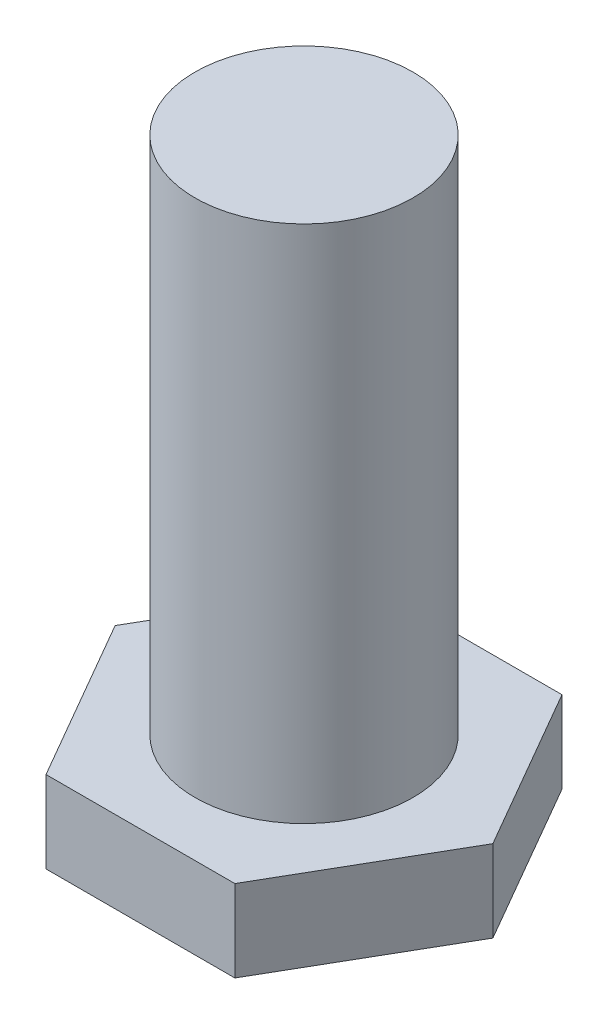
ISO-10303-21;
HEADER;
FILE_DESCRIPTION(('STEP AP214'),'2;1');
FILE_NAME('part.step','',(''),(''),'','','');
FILE_SCHEMA(('AUTOMOTIVE_DESIGN { 1 0 10303 214 1 1 1 1 }'));
ENDSEC;
DATA;
#1=APPLICATION_CONTEXT('core data for automotive mechanical design processes');
#2=APPLICATION_PROTOCOL_DEFINITION('international standard','automotive_design',2000,#1);
#3=PRODUCT_CONTEXT('',#1,'mechanical');
#4=PRODUCT('Part','Part','',(#3));
#5=PRODUCT_RELATED_PRODUCT_CATEGORY('part','',(#4));
#6=PRODUCT_DEFINITION_FORMATION('','',#4);
#7=PRODUCT_DEFINITION_CONTEXT('part definition',#1,'design');
#8=PRODUCT_DEFINITION('design','',#6,#7);
#9=PRODUCT_DEFINITION_SHAPE('','',#8);
#10=(LENGTH_UNIT() NAMED_UNIT(*) SI_UNIT(.MILLI.,.METRE.));
#11=(NAMED_UNIT(*) PLANE_ANGLE_UNIT() SI_UNIT($,.RADIAN.));
#12=(NAMED_UNIT(*) SI_UNIT($,.STERADIAN.) SOLID_ANGLE_UNIT());
#13=UNCERTAINTY_MEASURE_WITH_UNIT(LENGTH_MEASURE(1.E-05),#10,'distance_accuracy_value','');
#14=(GEOMETRIC_REPRESENTATION_CONTEXT(3) GLOBAL_UNCERTAINTY_ASSIGNED_CONTEXT((#13)) GLOBAL_UNIT_ASSIGNED_CONTEXT((#10,
#11,#12)) REPRESENTATION_CONTEXT('',''));
#15=CARTESIAN_POINT('',(0.,0.,0.));
#16=DIRECTION('',(0.,0.,1.));
#17=DIRECTION('',(1.,0.,0.));
#18=AXIS2_PLACEMENT_3D('',#15,#16,#17);
#19=CARTESIAN_POINT('',(3.46410161513775,3.,6.00000000000001));
#20=DIRECTION('',(-0.866025403784439,0.,-0.499999999999999));
#21=DIRECTION('',(-0.499999999999999,0.,0.866025403784439));
#22=AXIS2_PLACEMENT_3D('',#19,#20,#21);
#23=PLANE('',#22);
#24=DIRECTION('',(0.499999999999999,0.,-0.866025403784439));
#25=VECTOR('',#24,1.);
#26=CARTESIAN_POINT('',(3.46410161513775,0.,6.00000000000001));
#27=LINE('',#26,#25);
#28=CARTESIAN_POINT('',(3.46410161513775,0.,6.00000000000001));
#29=VERTEX_POINT('',#28);
#30=CARTESIAN_POINT('',(6.92820323027551,0.,0.));
#31=VERTEX_POINT('',#30);
#32=EDGE_CURVE('E116',#29,#31,#27,.T.);
#33=ORIENTED_EDGE('',*,*,#32,.T.);
#34=DIRECTION('',(0.,-1.,0.));
#35=VECTOR('',#34,1.);
#36=CARTESIAN_POINT('',(6.92820323027551,3.,0.));
#37=LINE('',#36,#35);
#38=CARTESIAN_POINT('',(6.92820323027551,3.,0.));
#39=VERTEX_POINT('',#38);
#40=EDGE_CURVE('E11',#39,#31,#37,.T.);
#41=ORIENTED_EDGE('',*,*,#40,.F.);
#42=DIRECTION('',(0.499999999999999,0.,-0.866025403784439));
#43=VECTOR('',#42,1.);
#44=CARTESIAN_POINT('',(3.46410161513775,3.,6.00000000000001));
#45=LINE('',#44,#43);
#46=CARTESIAN_POINT('',(3.46410161513775,3.,6.00000000000001));
#47=VERTEX_POINT('',#46);
#48=EDGE_CURVE('E127',#47,#39,#45,.T.);
#49=ORIENTED_EDGE('',*,*,#48,.F.);
#50=DIRECTION('',(0.,-1.,0.));
#51=VECTOR('',#50,1.);
#52=CARTESIAN_POINT('',(3.46410161513775,3.,6.00000000000001));
#53=LINE('',#52,#51);
#54=EDGE_CURVE('E112',#47,#29,#53,.T.);
#55=ORIENTED_EDGE('',*,*,#54,.T.);
#56=EDGE_LOOP('',(#33,#41,#49,#55));
#57=FACE_BOUND('',#56,.T.);
#58=ADVANCED_FACE('F32',(#57),#23,.F.);
#59=CARTESIAN_POINT('',(6.92820323027551,3.,0.));
#60=DIRECTION('',(-0.866025403784439,0.,0.5));
#61=DIRECTION('',(0.5,0.,0.866025403784439));
#62=AXIS2_PLACEMENT_3D('',#59,#60,#61);
#63=PLANE('',#62);
#64=DIRECTION('',(-0.5,0.,-0.866025403784439));
#65=VECTOR('',#64,1.);
#66=CARTESIAN_POINT('',(6.92820323027551,0.,0.));
#67=LINE('',#66,#65);
#68=CARTESIAN_POINT('',(3.46410161513774,0.,-6.00000000000003));
#69=VERTEX_POINT('',#68);
#70=EDGE_CURVE('E119',#31,#69,#67,.T.);
#71=ORIENTED_EDGE('',*,*,#70,.T.);
#72=DIRECTION('',(0.,-1.,0.));
#73=VECTOR('',#72,1.);
#74=CARTESIAN_POINT('',(3.46410161513774,3.,-6.00000000000003));
#75=LINE('',#74,#73);
#76=CARTESIAN_POINT('',(3.46410161513774,3.,-6.00000000000003));
#77=VERTEX_POINT('',#76);
#78=EDGE_CURVE('E40',#77,#69,#75,.T.);
#79=ORIENTED_EDGE('',*,*,#78,.F.);
#80=DIRECTION('',(-0.5,0.,-0.866025403784439));
#81=VECTOR('',#80,1.);
#82=CARTESIAN_POINT('',(6.92820323027551,3.,0.));
#83=LINE('',#82,#81);
#84=EDGE_CURVE('E85',#39,#77,#83,.T.);
#85=ORIENTED_EDGE('',*,*,#84,.F.);
#86=ORIENTED_EDGE('',*,*,#40,.T.);
#87=EDGE_LOOP('',(#71,#79,#85,#86));
#88=FACE_BOUND('',#87,.T.);
#89=ADVANCED_FACE('F152',(#88),#63,.F.);
#90=CARTESIAN_POINT('',(3.46410161513774,3.,-6.00000000000003));
#91=DIRECTION('',(0.,0.,1.));
#92=DIRECTION('',(1.,0.,0.));
#93=AXIS2_PLACEMENT_3D('',#90,#91,#92);
#94=PLANE('',#93);
#95=DIRECTION('',(-1.,0.,0.));
#96=VECTOR('',#95,1.);
#97=CARTESIAN_POINT('',(3.46410161513774,0.,-6.00000000000003));
#98=LINE('',#97,#96);
#99=CARTESIAN_POINT('',(-3.46410161513773,0.,-6.00000000000002));
#100=VERTEX_POINT('',#99);
#101=EDGE_CURVE('E122',#69,#100,#98,.T.);
#102=ORIENTED_EDGE('',*,*,#101,.T.);
#103=DIRECTION('',(0.,-1.,0.));
#104=VECTOR('',#103,1.);
#105=CARTESIAN_POINT('',(-3.46410161513773,3.,-6.00000000000002));
#106=LINE('',#105,#104);
#107=CARTESIAN_POINT('',(-3.46410161513773,3.,-6.00000000000002));
#108=VERTEX_POINT('',#107);
#109=EDGE_CURVE('E107',#108,#100,#106,.T.);
#110=ORIENTED_EDGE('',*,*,#109,.F.);
#111=DIRECTION('',(-1.,0.,0.));
#112=VECTOR('',#111,1.);
#113=CARTESIAN_POINT('',(3.46410161513774,3.,-6.00000000000003));
#114=LINE('',#113,#112);
#115=EDGE_CURVE('E98',#77,#108,#114,.T.);
#116=ORIENTED_EDGE('',*,*,#115,.F.);
#117=ORIENTED_EDGE('',*,*,#78,.T.);
#118=EDGE_LOOP('',(#102,#110,#116,#117));
#119=FACE_BOUND('',#118,.T.);
#120=ADVANCED_FACE('F133',(#119),#94,.F.);
#121=CARTESIAN_POINT('',(-3.46410161513773,3.,-6.00000000000002));
#122=DIRECTION('',(0.866025403784438,0.,0.500000000000001));
#123=DIRECTION('',(0.500000000000001,0.,-0.866025403784438));
#124=AXIS2_PLACEMENT_3D('',#121,#122,#123);
#125=PLANE('',#124);
#126=DIRECTION('',(-0.500000000000001,0.,0.866025403784438));
#127=VECTOR('',#126,1.);
#128=CARTESIAN_POINT('',(-3.46410161513773,0.,-6.00000000000002));
#129=LINE('',#128,#127);
#130=CARTESIAN_POINT('',(-6.9282032302755,0.,0.));
#131=VERTEX_POINT('',#130);
#132=EDGE_CURVE('E106',#100,#131,#129,.T.);
#133=ORIENTED_EDGE('',*,*,#132,.T.);
#134=DIRECTION('',(0.,-1.,0.));
#135=VECTOR('',#134,1.);
#136=CARTESIAN_POINT('',(-6.9282032302755,3.,0.));
#137=LINE('',#136,#135);
#138=CARTESIAN_POINT('',(-6.9282032302755,3.,0.));
#139=VERTEX_POINT('',#138);
#140=EDGE_CURVE('E103',#139,#131,#137,.T.);
#141=ORIENTED_EDGE('',*,*,#140,.F.);
#142=DIRECTION('',(-0.500000000000001,0.,0.866025403784438));
#143=VECTOR('',#142,1.);
#144=CARTESIAN_POINT('',(-3.46410161513773,3.,-6.00000000000002));
#145=LINE('',#144,#143);
#146=EDGE_CURVE('E92',#108,#139,#145,.T.);
#147=ORIENTED_EDGE('',*,*,#146,.F.);
#148=ORIENTED_EDGE('',*,*,#109,.T.);
#149=EDGE_LOOP('',(#133,#141,#147,#148));
#150=FACE_BOUND('',#149,.T.);
#151=ADVANCED_FACE('F104',(#150),#125,.F.);
#152=CARTESIAN_POINT('',(-6.9282032302755,3.,0.));
#153=DIRECTION('',(0.866025403784438,0.,-0.500000000000001));
#154=DIRECTION('',(-0.500000000000001,0.,-0.866025403784438));
#155=AXIS2_PLACEMENT_3D('',#152,#153,#154);
#156=PLANE('',#155);
#157=DIRECTION('',(0.500000000000001,0.,0.866025403784438));
#158=VECTOR('',#157,1.);
#159=CARTESIAN_POINT('',(-6.9282032302755,0.,0.));
#160=LINE('',#159,#158);
#161=CARTESIAN_POINT('',(-3.46410161513774,0.,6.00000000000001));
#162=VERTEX_POINT('',#161);
#163=EDGE_CURVE('E71',#131,#162,#160,.T.);
#164=ORIENTED_EDGE('',*,*,#163,.T.);
#165=DIRECTION('',(0.,-1.,0.));
#166=VECTOR('',#165,1.);
#167=CARTESIAN_POINT('',(-3.46410161513774,3.,6.00000000000001));
#168=LINE('',#167,#166);
#169=CARTESIAN_POINT('',(-3.46410161513774,3.,6.00000000000001));
#170=VERTEX_POINT('',#169);
#171=EDGE_CURVE('E108',#170,#162,#168,.T.);
#172=ORIENTED_EDGE('',*,*,#171,.F.);
#173=DIRECTION('',(0.500000000000001,0.,0.866025403784438));
#174=VECTOR('',#173,1.);
#175=CARTESIAN_POINT('',(-6.9282032302755,3.,0.));
#176=LINE('',#175,#174);
#177=EDGE_CURVE('E96',#139,#170,#176,.T.);
#178=ORIENTED_EDGE('',*,*,#177,.F.);
#179=ORIENTED_EDGE('',*,*,#140,.T.);
#180=EDGE_LOOP('',(#164,#172,#178,#179));
#181=FACE_BOUND('',#180,.T.);
#182=ADVANCED_FACE('F110',(#181),#156,.F.);
#183=CARTESIAN_POINT('',(-3.46410161513774,3.,6.00000000000001));
#184=DIRECTION('',(0.,0.,-1.));
#185=DIRECTION('',(-1.,0.,0.));
#186=AXIS2_PLACEMENT_3D('',#183,#184,#185);
#187=PLANE('',#186);
#188=DIRECTION('',(1.,0.,0.));
#189=VECTOR('',#188,1.);
#190=CARTESIAN_POINT('',(-3.46410161513774,0.,6.00000000000001));
#191=LINE('',#190,#189);
#192=EDGE_CURVE('E77',#162,#29,#191,.T.);
#193=ORIENTED_EDGE('',*,*,#192,.T.);
#194=ORIENTED_EDGE('',*,*,#54,.F.);
#195=DIRECTION('',(1.,0.,0.));
#196=VECTOR('',#195,1.);
#197=CARTESIAN_POINT('',(-3.46410161513774,3.,6.00000000000001));
#198=LINE('',#197,#196);
#199=EDGE_CURVE('E48',#170,#47,#198,.T.);
#200=ORIENTED_EDGE('',*,*,#199,.F.);
#201=ORIENTED_EDGE('',*,*,#171,.T.);
#202=EDGE_LOOP('',(#193,#194,#200,#201));
#203=FACE_BOUND('',#202,.T.);
#204=ADVANCED_FACE('F140',(#203),#187,.F.);
#205=CARTESIAN_POINT('',(0.,3.,0.));
#206=DIRECTION('',(0.,1.,0.));
#207=DIRECTION('',(0.,0.,1.));
#208=AXIS2_PLACEMENT_3D('',#205,#206,#207);
#209=PLANE('',#208);
#210=CARTESIAN_POINT('',(0.,3.,0.));
#211=DIRECTION('',(0.,1.,0.));
#212=DIRECTION('',(0.,0.,1.));
#213=AXIS2_PLACEMENT_3D('',#210,#211,#212);
#214=CIRCLE('',#213,4.);
#215=CARTESIAN_POINT('',(0.,3.,-4.));
#216=VERTEX_POINT('',#215);
#217=EDGE_CURVE('E213',#216,#216,#214,.T.);
#218=ORIENTED_EDGE('',*,*,#217,.F.);
#219=EDGE_LOOP('',(#218));
#220=FACE_BOUND('',#219,.T.);
#221=ORIENTED_EDGE('',*,*,#48,.T.);
#222=ORIENTED_EDGE('',*,*,#84,.T.);
#223=ORIENTED_EDGE('',*,*,#115,.T.);
#224=ORIENTED_EDGE('',*,*,#146,.T.);
#225=ORIENTED_EDGE('',*,*,#177,.T.);
#226=ORIENTED_EDGE('',*,*,#199,.T.);
#227=EDGE_LOOP('',(#221,#222,#223,#224,#225,#226));
#228=FACE_BOUND('',#227,.T.);
#229=ADVANCED_FACE('F94',(#220,#228),#209,.T.);
#230=CARTESIAN_POINT('',(0.,0.,0.));
#231=DIRECTION('',(0.,1.,0.));
#232=DIRECTION('',(0.,0.,1.));
#233=AXIS2_PLACEMENT_3D('',#230,#231,#232);
#234=PLANE('',#233);
#235=ORIENTED_EDGE('',*,*,#32,.F.);
#236=ORIENTED_EDGE('',*,*,#192,.F.);
#237=ORIENTED_EDGE('',*,*,#163,.F.);
#238=ORIENTED_EDGE('',*,*,#132,.F.);
#239=ORIENTED_EDGE('',*,*,#101,.F.);
#240=ORIENTED_EDGE('',*,*,#70,.F.);
#241=EDGE_LOOP('',(#235,#236,#237,#238,#239,#240));
#242=FACE_BOUND('',#241,.T.);
#243=ADVANCED_FACE('F136',(#242),#234,.F.);
#244=CARTESIAN_POINT('',(0.,22.05,0.));
#245=DIRECTION('',(0.,-1.,0.));
#246=DIRECTION('',(0.,0.,-1.));
#247=AXIS2_PLACEMENT_3D('',#244,#245,#246);
#248=CYLINDRICAL_SURFACE('',#247,4.);
#249=CARTESIAN_POINT('',(0.,22.05,0.));
#250=DIRECTION('',(0.,1.,0.));
#251=DIRECTION('',(0.,0.,1.));
#252=AXIS2_PLACEMENT_3D('',#249,#250,#251);
#253=CIRCLE('',#252,4.);
#254=CARTESIAN_POINT('',(0.,22.05,-4.));
#255=VERTEX_POINT('',#254);
#256=EDGE_CURVE('E120',#255,#255,#253,.T.);
#257=CARTESIAN_POINT('',(0.,22.05,-4.));
#258=CARTESIAN_POINT('',(0.,21.8515625,-4.));
#259=CARTESIAN_POINT('',(0.,21.653125,-4.));
#260=CARTESIAN_POINT('',(0.,21.25625,-4.));
#261=CARTESIAN_POINT('',(0.,21.0578125,-4.));
#262=CARTESIAN_POINT('',(0.,20.6609375,-4.));
#263=CARTESIAN_POINT('',(0.,20.4625,-4.));
#264=CARTESIAN_POINT('',(0.,20.065625,-4.));
#265=CARTESIAN_POINT('',(0.,19.8671875,-4.));
#266=CARTESIAN_POINT('',(0.,19.4703125,-4.));
#267=CARTESIAN_POINT('',(0.,19.271875,-4.));
#268=CARTESIAN_POINT('',(0.,18.875,-4.));
#269=CARTESIAN_POINT('',(0.,18.6765625,-4.));
#270=CARTESIAN_POINT('',(0.,18.2796875,-4.));
#271=CARTESIAN_POINT('',(0.,18.08125,-4.));
#272=CARTESIAN_POINT('',(0.,17.684375,-4.));
#273=CARTESIAN_POINT('',(0.,17.4859375,-4.));
#274=CARTESIAN_POINT('',(0.,17.0890625,-4.));
#275=CARTESIAN_POINT('',(0.,16.890625,-4.));
#276=CARTESIAN_POINT('',(0.,16.49375,-4.));
#277=CARTESIAN_POINT('',(0.,16.2953125,-4.));
#278=CARTESIAN_POINT('',(0.,15.8984375,-4.));
#279=CARTESIAN_POINT('',(0.,15.7,-4.));
#280=CARTESIAN_POINT('',(0.,15.303125,-4.));
#281=CARTESIAN_POINT('',(0.,15.1046875,-4.));
#282=CARTESIAN_POINT('',(0.,14.7078125,-4.));
#283=CARTESIAN_POINT('',(0.,14.509375,-4.));
#284=CARTESIAN_POINT('',(0.,14.1125,-4.));
#285=CARTESIAN_POINT('',(0.,13.9140625,-4.));
#286=CARTESIAN_POINT('',(0.,13.5171875,-4.));
#287=CARTESIAN_POINT('',(0.,13.31875,-4.));
#288=CARTESIAN_POINT('',(0.,12.921875,-4.));
#289=CARTESIAN_POINT('',(0.,12.7234375,-4.));
#290=CARTESIAN_POINT('',(0.,12.3265625,-4.));
#291=CARTESIAN_POINT('',(0.,12.128125,-4.));
#292=CARTESIAN_POINT('',(0.,11.73125,-4.));
#293=CARTESIAN_POINT('',(0.,11.5328125,-4.));
#294=CARTESIAN_POINT('',(0.,11.1359375,-4.));
#295=CARTESIAN_POINT('',(0.,10.9375,-4.));
#296=CARTESIAN_POINT('',(0.,10.540625,-4.));
#297=CARTESIAN_POINT('',(0.,10.3421875,-4.));
#298=CARTESIAN_POINT('',(0.,9.9453125,-4.));
#299=CARTESIAN_POINT('',(0.,9.746875,-4.));
#300=CARTESIAN_POINT('',(0.,9.35,-4.));
#301=CARTESIAN_POINT('',(0.,9.1515625,-4.));
#302=CARTESIAN_POINT('',(0.,8.7546875,-4.));
#303=CARTESIAN_POINT('',(0.,8.55625,-4.));
#304=CARTESIAN_POINT('',(0.,8.159375,-4.));
#305=CARTESIAN_POINT('',(0.,7.9609375,-4.));
#306=CARTESIAN_POINT('',(0.,7.5640625,-4.));
#307=CARTESIAN_POINT('',(0.,7.365625,-4.));
#308=CARTESIAN_POINT('',(0.,6.96875,-4.));
#309=CARTESIAN_POINT('',(0.,6.7703125,-4.));
#310=CARTESIAN_POINT('',(0.,6.3734375,-4.));
#311=CARTESIAN_POINT('',(0.,6.175,-4.));
#312=CARTESIAN_POINT('',(0.,5.778125,-4.));
#313=CARTESIAN_POINT('',(0.,5.5796875,-4.));
#314=CARTESIAN_POINT('',(0.,5.1828125,-4.));
#315=CARTESIAN_POINT('',(0.,4.984375,-4.));
#316=CARTESIAN_POINT('',(0.,4.5875,-4.));
#317=CARTESIAN_POINT('',(0.,4.3890625,-4.));
#318=CARTESIAN_POINT('',(0.,3.9921875,-4.));
#319=CARTESIAN_POINT('',(0.,3.79375,-4.));
#320=CARTESIAN_POINT('',(0.,3.396875,-4.));
#321=CARTESIAN_POINT('',(0.,3.1984375,-4.));
#322=CARTESIAN_POINT('',(0.,3.,-4.));
#323=B_SPLINE_CURVE_WITH_KNOTS('',3,(#257,#258,#259,#260,#261,#262,#263,#264,#265,#266,#267,
#268,#269,#270,#271,#272,#273,#274,#275,#276,#277,#278,#279,#280,#281,#282,#283,#284,#285,#286,
#287,#288,#289,#290,#291,#292,#293,#294,#295,#296,#297,#298,#299,#300,#301,#302,#303,#304,#305,
#306,#307,#308,#309,#310,#311,#312,#313,#314,#315,#316,#317,#318,#319,#320,#321,#322),
.UNSPECIFIED.,.F.,.F.,(4,2,2,2,2,2,2,2,2,2,2,2,2,2,2,2,2,2,2,2,2,2,2,2,2,2,2,2,2,2,2,2,4),(0.,
0.595312499999997,1.190625,1.7859375,2.38125,2.9765625,3.571875,4.1671875,4.7625,5.3578125,
5.953125,6.5484375,7.14375,7.7390625,8.334375,8.9296875,9.525,10.1203125,10.715625,11.3109375,
11.90625,12.5015625,13.096875,13.6921875,14.2875,14.8828125,15.478125,16.0734375,16.66875,
17.2640625,17.859375,18.4546875,19.05),.UNSPECIFIED.);
#324=EDGE_CURVE('BSEAM184',#255,#216,#323,.T.);
#325=ORIENTED_EDGE('',*,*,#256,.F.);
#326=ORIENTED_EDGE('',*,*,#217,.T.);
#327=ORIENTED_EDGE('',*,*,#324,.T.);
#328=ORIENTED_EDGE('',*,*,#324,.F.);
#329=EDGE_LOOP('',(#325,#327,#326,#328));
#330=FACE_BOUND('',#329,.T.);
#331=ADVANCED_FACE('F184',(#330),#248,.T.);
#332=CARTESIAN_POINT('',(0.,22.05,0.));
#333=DIRECTION('',(0.,1.,0.));
#334=DIRECTION('',(0.,0.,1.));
#335=AXIS2_PLACEMENT_3D('',#332,#333,#334);
#336=PLANE('',#335);
#337=ORIENTED_EDGE('',*,*,#256,.T.);
#338=EDGE_LOOP('',(#337));
#339=FACE_BOUND('',#338,.T.);
#340=ADVANCED_FACE('F197',(#339),#336,.T.);
#341=CLOSED_SHELL('',(#58,#89,#120,#151,#182,#204,#229,#243,#331,#340));
#342=MANIFOLD_SOLID_BREP('B2',#341);
#343=ADVANCED_BREP_SHAPE_REPRESENTATION('',(#18,#342),#14);
#344=SHAPE_DEFINITION_REPRESENTATION(#9,#343);
ENDSEC;
END-ISO-10303-21;
